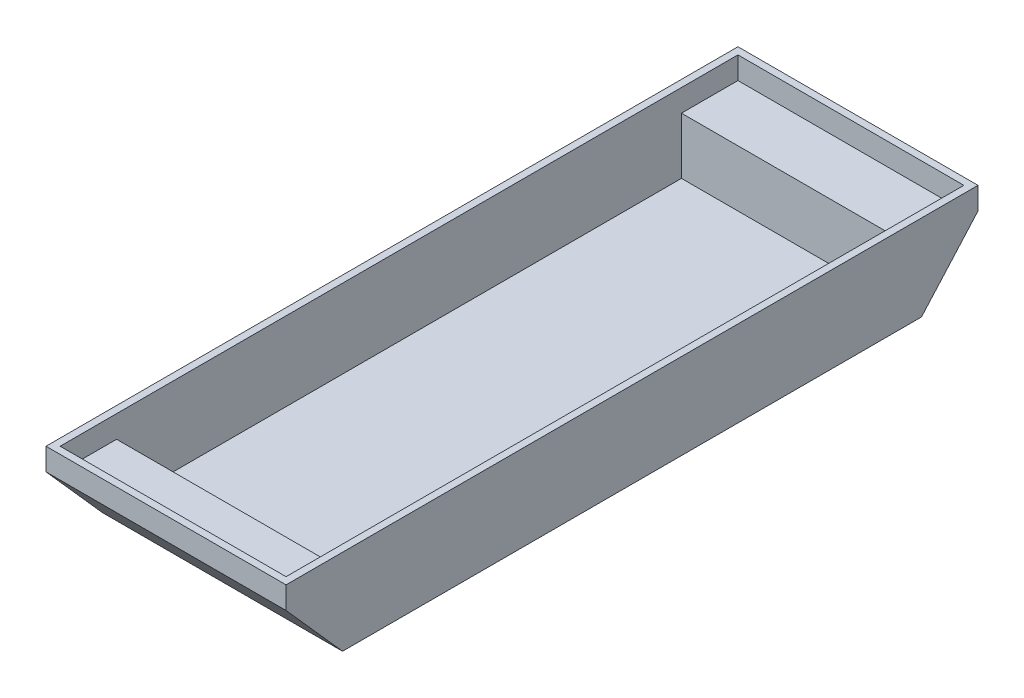
ISO-10303-21;
HEADER;
FILE_DESCRIPTION(('STEP AP214'),'2;1');
FILE_NAME('part.step','',(''),(''),'','','');
FILE_SCHEMA(('AUTOMOTIVE_DESIGN { 1 0 10303 214 1 1 1 1 }'));
ENDSEC;
DATA;
#1=APPLICATION_CONTEXT('core data for automotive mechanical design processes');
#2=APPLICATION_PROTOCOL_DEFINITION('international standard','automotive_design',2000,#1);
#3=PRODUCT_CONTEXT('',#1,'mechanical');
#4=PRODUCT('Part','Part','',(#3));
#5=PRODUCT_RELATED_PRODUCT_CATEGORY('part','',(#4));
#6=PRODUCT_DEFINITION_FORMATION('','',#4);
#7=PRODUCT_DEFINITION_CONTEXT('part definition',#1,'design');
#8=PRODUCT_DEFINITION('design','',#6,#7);
#9=PRODUCT_DEFINITION_SHAPE('','',#8);
#10=(LENGTH_UNIT() NAMED_UNIT(*) SI_UNIT(.MILLI.,.METRE.));
#11=(NAMED_UNIT(*) PLANE_ANGLE_UNIT() SI_UNIT($,.RADIAN.));
#12=(NAMED_UNIT(*) SI_UNIT($,.STERADIAN.) SOLID_ANGLE_UNIT());
#13=UNCERTAINTY_MEASURE_WITH_UNIT(LENGTH_MEASURE(1.E-05),#10,'distance_accuracy_value','');
#14=(GEOMETRIC_REPRESENTATION_CONTEXT(3) GLOBAL_UNCERTAINTY_ASSIGNED_CONTEXT((#13)) GLOBAL_UNIT_ASSIGNED_CONTEXT((#10,
#11,#12)) REPRESENTATION_CONTEXT('',''));
#15=CARTESIAN_POINT('',(0.,0.,0.));
#16=DIRECTION('',(0.,0.,1.));
#17=DIRECTION('',(1.,0.,0.));
#18=AXIS2_PLACEMENT_3D('',#15,#16,#17);
#19=CARTESIAN_POINT('',(26.9875,0.,-106.686950400119));
#20=DIRECTION('',(0.,0.,-1.));
#21=DIRECTION('',(-1.,0.,0.));
#22=AXIS2_PLACEMENT_3D('',#19,#20,#21);
#23=PLANE('',#22);
#24=DIRECTION('',(0.,1.,0.));
#25=VECTOR('',#24,1.);
#26=CARTESIAN_POINT('',(-25.4,0.,-106.686950400119));
#27=LINE('',#26,#25);
#28=CARTESIAN_POINT('',(-25.4,46.8041255840611,-106.686950400119));
#29=VERTEX_POINT('',#28);
#30=CARTESIAN_POINT('',(-25.4,51.804125584061,-106.686950400119));
#31=VERTEX_POINT('',#30);
#32=EDGE_CURVE('E547',#29,#31,#27,.T.);
#33=ORIENTED_EDGE('',*,*,#32,.F.);
#34=DIRECTION('',(-1.,0.,0.));
#35=VECTOR('',#34,1.);
#36=CARTESIAN_POINT('',(26.9875,46.8041255840611,-106.686950400119));
#37=LINE('',#36,#35);
#38=CARTESIAN_POINT('',(25.4,46.8041255840611,-106.686950400119));
#39=VERTEX_POINT('',#38);
#40=EDGE_CURVE('E158',#39,#29,#37,.T.);
#41=ORIENTED_EDGE('',*,*,#40,.F.);
#42=DIRECTION('',(0.,-1.,0.));
#43=VECTOR('',#42,1.);
#44=CARTESIAN_POINT('',(25.4,0.,-106.686950400119));
#45=LINE('',#44,#43);
#46=CARTESIAN_POINT('',(25.4,51.8041255840611,-106.686950400119));
#47=VERTEX_POINT('',#46);
#48=EDGE_CURVE('E55',#47,#39,#45,.T.);
#49=ORIENTED_EDGE('',*,*,#48,.F.);
#50=DIRECTION('',(-1.,0.,0.));
#51=VECTOR('',#50,1.);
#52=CARTESIAN_POINT('',(26.9875,51.8041255840611,-106.686950400119));
#53=LINE('',#52,#51);
#54=EDGE_CURVE('E171',#47,#31,#53,.T.);
#55=ORIENTED_EDGE('',*,*,#54,.T.);
#56=EDGE_LOOP('',(#33,#41,#49,#55));
#57=FACE_BOUND('',#56,.T.);
#58=ADVANCED_FACE('F39',(#57),#23,.F.);
#59=CARTESIAN_POINT('',(26.9875,46.8041255840611,0.));
#60=DIRECTION('',(0.,1.,0.));
#61=DIRECTION('',(0.,0.,1.));
#62=AXIS2_PLACEMENT_3D('',#59,#60,#61);
#63=PLANE('',#62);
#64=ORIENTED_EDGE('',*,*,#40,.T.);
#65=DIRECTION('',(0.,0.,-1.));
#66=VECTOR('',#65,1.);
#67=CARTESIAN_POINT('',(-25.4,46.8041255840611,-93.9869504001185));
#68=LINE('',#67,#66);
#69=CARTESIAN_POINT('',(-25.4,46.8041255840611,-93.9869504001185));
#70=VERTEX_POINT('',#69);
#71=EDGE_CURVE('E146',#70,#29,#68,.T.);
#72=ORIENTED_EDGE('',*,*,#71,.F.);
#73=DIRECTION('',(-1.,0.,0.));
#74=VECTOR('',#73,1.);
#75=CARTESIAN_POINT('',(26.9875,46.8041255840611,-93.9869504001185));
#76=LINE('',#75,#74);
#77=CARTESIAN_POINT('',(25.4,46.8041255840611,-93.9869504001185));
#78=VERTEX_POINT('',#77);
#79=EDGE_CURVE('E157',#78,#70,#76,.T.);
#80=ORIENTED_EDGE('',*,*,#79,.F.);
#81=DIRECTION('',(0.,0.,-1.));
#82=VECTOR('',#81,1.);
#83=CARTESIAN_POINT('',(25.4,46.8041255840611,-93.9869504001185));
#84=LINE('',#83,#82);
#85=EDGE_CURVE('E63',#78,#39,#84,.T.);
#86=ORIENTED_EDGE('',*,*,#85,.T.);
#87=EDGE_LOOP('',(#64,#72,#80,#86));
#88=FACE_BOUND('',#87,.T.);
#89=ADVANCED_FACE('F156',(#88),#63,.T.);
#90=CARTESIAN_POINT('',(26.9875,0.,-93.9869504001185));
#91=DIRECTION('',(0.,0.,1.));
#92=DIRECTION('',(1.,0.,0.));
#93=AXIS2_PLACEMENT_3D('',#90,#91,#92);
#94=PLANE('',#93);
#95=ORIENTED_EDGE('',*,*,#79,.T.);
#96=DIRECTION('',(0.,1.,0.));
#97=VECTOR('',#96,1.);
#98=CARTESIAN_POINT('',(-25.4,34.1041255840611,-93.9869504001185));
#99=LINE('',#98,#97);
#100=CARTESIAN_POINT('',(-25.4,34.1041255840611,-93.9869504001185));
#101=VERTEX_POINT('',#100);
#102=EDGE_CURVE('E143',#101,#70,#99,.T.);
#103=ORIENTED_EDGE('',*,*,#102,.F.);
#104=DIRECTION('',(-1.,0.,0.));
#105=VECTOR('',#104,1.);
#106=CARTESIAN_POINT('',(26.9875,34.1041255840611,-93.9869504001185));
#107=LINE('',#106,#105);
#108=CARTESIAN_POINT('',(25.4,34.1041255840611,-93.9869504001185));
#109=VERTEX_POINT('',#108);
#110=EDGE_CURVE('E166',#109,#101,#107,.T.);
#111=ORIENTED_EDGE('',*,*,#110,.F.);
#112=DIRECTION('',(0.,1.,0.));
#113=VECTOR('',#112,1.);
#114=CARTESIAN_POINT('',(25.4,34.1041255840611,-93.9869504001185));
#115=LINE('',#114,#113);
#116=EDGE_CURVE('E164',#109,#78,#115,.T.);
#117=ORIENTED_EDGE('',*,*,#116,.T.);
#118=EDGE_LOOP('',(#95,#103,#111,#117));
#119=FACE_BOUND('',#118,.T.);
#120=ADVANCED_FACE('F162',(#119),#94,.T.);
#121=CARTESIAN_POINT('',(26.9875,34.1041255840611,0.));
#122=DIRECTION('',(0.,1.,0.));
#123=DIRECTION('',(0.,0.,1.));
#124=AXIS2_PLACEMENT_3D('',#121,#122,#123);
#125=PLANE('',#124);
#126=ORIENTED_EDGE('',*,*,#110,.T.);
#127=DIRECTION('',(0.,0.,-1.));
#128=VECTOR('',#127,1.);
#129=CARTESIAN_POINT('',(-25.4,34.1041255840611,33.0130495998815));
#130=LINE('',#129,#128);
#131=CARTESIAN_POINT('',(-25.4,34.1041255840611,33.0130495998815));
#132=VERTEX_POINT('',#131);
#133=EDGE_CURVE('E149',#132,#101,#130,.T.);
#134=ORIENTED_EDGE('',*,*,#133,.F.);
#135=DIRECTION('',(-1.,0.,0.));
#136=VECTOR('',#135,1.);
#137=CARTESIAN_POINT('',(26.9875,34.1041255840611,33.0130495998815));
#138=LINE('',#137,#136);
#139=CARTESIAN_POINT('',(25.4,34.1041255840611,33.0130495998815));
#140=VERTEX_POINT('',#139);
#141=EDGE_CURVE('E174',#140,#132,#138,.T.);
#142=ORIENTED_EDGE('',*,*,#141,.F.);
#143=DIRECTION('',(0.,0.,-1.));
#144=VECTOR('',#143,1.);
#145=CARTESIAN_POINT('',(25.4,34.1041255840611,33.0130495998815));
#146=LINE('',#145,#144);
#147=EDGE_CURVE('E259',#140,#109,#146,.T.);
#148=ORIENTED_EDGE('',*,*,#147,.T.);
#149=EDGE_LOOP('',(#126,#134,#142,#148));
#150=FACE_BOUND('',#149,.T.);
#151=ADVANCED_FACE('F258',(#150),#125,.T.);
#152=CARTESIAN_POINT('',(26.9875,0.,33.0130495998815));
#153=DIRECTION('',(0.,0.,-1.));
#154=DIRECTION('',(-1.,0.,0.));
#155=AXIS2_PLACEMENT_3D('',#152,#153,#154);
#156=PLANE('',#155);
#157=ORIENTED_EDGE('',*,*,#141,.T.);
#158=DIRECTION('',(0.,-1.,0.));
#159=VECTOR('',#158,1.);
#160=CARTESIAN_POINT('',(-25.4,46.8041255840611,33.0130495998815));
#161=LINE('',#160,#159);
#162=CARTESIAN_POINT('',(-25.4,46.8041255840611,33.0130495998815));
#163=VERTEX_POINT('',#162);
#164=EDGE_CURVE('E253',#163,#132,#161,.T.);
#165=ORIENTED_EDGE('',*,*,#164,.F.);
#166=DIRECTION('',(-1.,0.,0.));
#167=VECTOR('',#166,1.);
#168=CARTESIAN_POINT('',(26.9875,46.8041255840611,33.0130495998815));
#169=LINE('',#168,#167);
#170=CARTESIAN_POINT('',(25.4,46.8041255840611,33.0130495998815));
#171=VERTEX_POINT('',#170);
#172=EDGE_CURVE('E242',#171,#163,#169,.T.);
#173=ORIENTED_EDGE('',*,*,#172,.F.);
#174=DIRECTION('',(0.,-1.,0.));
#175=VECTOR('',#174,1.);
#176=CARTESIAN_POINT('',(25.4,46.8041255840611,33.0130495998815));
#177=LINE('',#176,#175);
#178=EDGE_CURVE('E255',#171,#140,#177,.T.);
#179=ORIENTED_EDGE('',*,*,#178,.T.);
#180=EDGE_LOOP('',(#157,#165,#173,#179));
#181=FACE_BOUND('',#180,.T.);
#182=ADVANCED_FACE('F251',(#181),#156,.T.);
#183=CARTESIAN_POINT('',(26.9875,46.8041255840611,0.));
#184=DIRECTION('',(0.,1.,0.));
#185=DIRECTION('',(0.,0.,1.));
#186=AXIS2_PLACEMENT_3D('',#183,#184,#185);
#187=PLANE('',#186);
#188=ORIENTED_EDGE('',*,*,#172,.T.);
#189=DIRECTION('',(0.,0.,-1.));
#190=VECTOR('',#189,1.);
#191=CARTESIAN_POINT('',(-25.4,46.804125584061,47.3005495998815));
#192=LINE('',#191,#190);
#193=CARTESIAN_POINT('',(-25.4,46.804125584061,45.7130495998815));
#194=VERTEX_POINT('',#193);
#195=EDGE_CURVE('E545',#194,#163,#192,.T.);
#196=ORIENTED_EDGE('',*,*,#195,.F.);
#197=DIRECTION('',(-1.,0.,0.));
#198=VECTOR('',#197,1.);
#199=CARTESIAN_POINT('',(26.9875,46.804125584061,45.7130495998815));
#200=LINE('',#199,#198);
#201=CARTESIAN_POINT('',(25.4,46.804125584061,45.7130495998815));
#202=VERTEX_POINT('',#201);
#203=EDGE_CURVE('E238',#202,#194,#200,.T.);
#204=ORIENTED_EDGE('',*,*,#203,.F.);
#205=DIRECTION('',(0.,0.,-1.));
#206=VECTOR('',#205,1.);
#207=CARTESIAN_POINT('',(25.4,46.804125584061,47.3005495998815));
#208=LINE('',#207,#206);
#209=EDGE_CURVE('E269',#202,#171,#208,.T.);
#210=ORIENTED_EDGE('',*,*,#209,.T.);
#211=EDGE_LOOP('',(#188,#196,#204,#210));
#212=FACE_BOUND('',#211,.T.);
#213=ADVANCED_FACE('F344',(#212),#187,.T.);
#214=CARTESIAN_POINT('',(26.9875,0.,45.7130495998815));
#215=DIRECTION('',(0.,0.,-1.));
#216=DIRECTION('',(-1.,0.,0.));
#217=AXIS2_PLACEMENT_3D('',#214,#215,#216);
#218=PLANE('',#217);
#219=ORIENTED_EDGE('',*,*,#203,.T.);
#220=DIRECTION('',(0.,1.,0.));
#221=VECTOR('',#220,1.);
#222=CARTESIAN_POINT('',(-25.4,0.,45.7130495998815));
#223=LINE('',#222,#221);
#224=CARTESIAN_POINT('',(-25.4,51.804125584061,45.7130495998815));
#225=VERTEX_POINT('',#224);
#226=EDGE_CURVE('E542',#194,#225,#223,.T.);
#227=ORIENTED_EDGE('',*,*,#226,.T.);
#228=DIRECTION('',(-1.,0.,0.));
#229=VECTOR('',#228,1.);
#230=CARTESIAN_POINT('',(26.9875,51.8041255840611,45.7130495998815));
#231=LINE('',#230,#229);
#232=CARTESIAN_POINT('',(25.4,51.8041255840611,45.7130495998815));
#233=VERTEX_POINT('',#232);
#234=EDGE_CURVE('E234',#233,#225,#231,.T.);
#235=ORIENTED_EDGE('',*,*,#234,.F.);
#236=DIRECTION('',(0.,-1.,0.));
#237=VECTOR('',#236,1.);
#238=CARTESIAN_POINT('',(25.4,0.,45.7130495998815));
#239=LINE('',#238,#237);
#240=EDGE_CURVE('E279',#233,#202,#239,.T.);
#241=ORIENTED_EDGE('',*,*,#240,.T.);
#242=EDGE_LOOP('',(#219,#227,#235,#241));
#243=FACE_BOUND('',#242,.T.);
#244=ADVANCED_FACE('F340',(#243),#218,.T.);
#245=CARTESIAN_POINT('',(26.9875,-2.82879678490727,3.18239638302067));
#246=DIRECTION('',(0.,0.66436383882992,-0.747409318683659));
#247=DIRECTION('',(0.,0.747409318683659,0.66436383882992));
#248=AXIS2_PLACEMENT_3D('',#245,#246,#247);
#249=PLANE('',#248);
#250=DIRECTION('',(0.,-0.747409318683659,-0.66436383882992));
#251=VECTOR('',#250,1.);
#252=CARTESIAN_POINT('',(-26.9875,-2.82879678490727,3.18239638302067));
#253=LINE('',#252,#251);
#254=CARTESIAN_POINT('',(-26.9875,46.804125584061,47.3005495998815));
#255=VERTEX_POINT('',#254);
#256=CARTESIAN_POINT('',(-26.9875,32.5166255840611,34.6005495998815));
#257=VERTEX_POINT('',#256);
#258=EDGE_CURVE('E205',#255,#257,#253,.T.);
#259=ORIENTED_EDGE('',*,*,#258,.T.);
#260=DIRECTION('',(-1.,0.,0.));
#261=VECTOR('',#260,1.);
#262=CARTESIAN_POINT('',(26.9875,32.5166255840611,34.6005495998815));
#263=LINE('',#262,#261);
#264=CARTESIAN_POINT('',(26.9875,32.5166255840611,34.6005495998815));
#265=VERTEX_POINT('',#264);
#266=EDGE_CURVE('E11',#265,#257,#263,.T.);
#267=ORIENTED_EDGE('',*,*,#266,.F.);
#268=DIRECTION('',(0.,-0.747409318683659,-0.66436383882992));
#269=VECTOR('',#268,1.);
#270=CARTESIAN_POINT('',(26.9875,-2.82879678490727,3.18239638302067));
#271=LINE('',#270,#269);
#272=CARTESIAN_POINT('',(26.9875,46.804125584061,47.3005495998815));
#273=VERTEX_POINT('',#272);
#274=EDGE_CURVE('E226',#273,#265,#271,.T.);
#275=ORIENTED_EDGE('',*,*,#274,.F.);
#276=DIRECTION('',(-1.,0.,0.));
#277=VECTOR('',#276,1.);
#278=CARTESIAN_POINT('',(26.9875,46.804125584061,47.3005495998815));
#279=LINE('',#278,#277);
#280=EDGE_CURVE('E227',#273,#255,#279,.T.);
#281=ORIENTED_EDGE('',*,*,#280,.T.);
#282=EDGE_LOOP('',(#259,#267,#275,#281));
#283=FACE_BOUND('',#282,.T.);
#284=ADVANCED_FACE('F41',(#283),#249,.F.);
#285=CARTESIAN_POINT('',(26.9875,32.5166255840611,0.));
#286=DIRECTION('',(0.,1.,0.));
#287=DIRECTION('',(0.,0.,1.));
#288=AXIS2_PLACEMENT_3D('',#285,#286,#287);
#289=PLANE('',#288);
#290=DIRECTION('',(0.,0.,-1.));
#291=VECTOR('',#290,1.);
#292=CARTESIAN_POINT('',(-26.9875,32.5166255840611,0.));
#293=LINE('',#292,#291);
#294=CARTESIAN_POINT('',(-26.9875,32.5166255840611,-95.5744504001185));
#295=VERTEX_POINT('',#294);
#296=EDGE_CURVE('E198',#257,#295,#293,.T.);
#297=ORIENTED_EDGE('',*,*,#296,.T.);
#298=DIRECTION('',(-1.,0.,0.));
#299=VECTOR('',#298,1.);
#300=CARTESIAN_POINT('',(26.9875,32.5166255840611,-95.5744504001185));
#301=LINE('',#300,#299);
#302=CARTESIAN_POINT('',(26.9875,32.5166255840611,-95.5744504001185));
#303=VERTEX_POINT('',#302);
#304=EDGE_CURVE('E48',#303,#295,#301,.T.);
#305=ORIENTED_EDGE('',*,*,#304,.F.);
#306=DIRECTION('',(0.,0.,-1.));
#307=VECTOR('',#306,1.);
#308=CARTESIAN_POINT('',(26.9875,32.5166255840611,0.));
#309=LINE('',#308,#307);
#310=EDGE_CURVE('E286',#265,#303,#309,.T.);
#311=ORIENTED_EDGE('',*,*,#310,.F.);
#312=ORIENTED_EDGE('',*,*,#266,.T.);
#313=EDGE_LOOP('',(#297,#305,#311,#312));
#314=FACE_BOUND('',#313,.T.);
#315=ADVANCED_FACE('F199',(#314),#289,.F.);
#316=CARTESIAN_POINT('',(26.9875,-33.1054923546802,-37.2436788990152));
#317=DIRECTION('',(0.,-0.66436383882992,-0.747409318683659));
#318=DIRECTION('',(0.,0.747409318683659,-0.66436383882992));
#319=AXIS2_PLACEMENT_3D('',#316,#317,#318);
#320=PLANE('',#319);
#321=DIRECTION('',(0.,-0.747409318683659,0.66436383882992));
#322=VECTOR('',#321,1.);
#323=CARTESIAN_POINT('',(-26.9875,-33.1054923546802,-37.2436788990152));
#324=LINE('',#323,#322);
#325=CARTESIAN_POINT('',(-26.9875,46.8041255840611,-108.274450400119));
#326=VERTEX_POINT('',#325);
#327=EDGE_CURVE('E194',#326,#295,#324,.T.);
#328=ORIENTED_EDGE('',*,*,#327,.F.);
#329=DIRECTION('',(-1.,0.,0.));
#330=VECTOR('',#329,1.);
#331=CARTESIAN_POINT('',(26.9875,46.8041255840611,-108.274450400119));
#332=LINE('',#331,#330);
#333=CARTESIAN_POINT('',(26.9875,46.8041255840611,-108.274450400119));
#334=VERTEX_POINT('',#333);
#335=EDGE_CURVE('E183',#334,#326,#332,.T.);
#336=ORIENTED_EDGE('',*,*,#335,.F.);
#337=DIRECTION('',(0.,-0.747409318683659,0.66436383882992));
#338=VECTOR('',#337,1.);
#339=CARTESIAN_POINT('',(26.9875,-33.1054923546802,-37.2436788990152));
#340=LINE('',#339,#338);
#341=EDGE_CURVE('E196',#334,#303,#340,.T.);
#342=ORIENTED_EDGE('',*,*,#341,.T.);
#343=ORIENTED_EDGE('',*,*,#304,.T.);
#344=EDGE_LOOP('',(#328,#336,#342,#343));
#345=FACE_BOUND('',#344,.T.);
#346=ADVANCED_FACE('F192',(#345),#320,.T.);
#347=CARTESIAN_POINT('',(26.9875,0.,-108.274450400119));
#348=DIRECTION('',(0.,0.,1.));
#349=DIRECTION('',(1.,0.,0.));
#350=AXIS2_PLACEMENT_3D('',#347,#348,#349);
#351=PLANE('',#350);
#352=DIRECTION('',(0.,1.,0.));
#353=VECTOR('',#352,1.);
#354=CARTESIAN_POINT('',(-26.9875,0.,-108.274450400119));
#355=LINE('',#354,#353);
#356=CARTESIAN_POINT('',(-26.9875,51.8041255840611,-108.274450400119));
#357=VERTEX_POINT('',#356);
#358=EDGE_CURVE('E211',#326,#357,#355,.T.);
#359=ORIENTED_EDGE('',*,*,#358,.T.);
#360=DIRECTION('',(-1.,0.,0.));
#361=VECTOR('',#360,1.);
#362=CARTESIAN_POINT('',(26.9875,51.8041255840611,-108.274450400119));
#363=LINE('',#362,#361);
#364=CARTESIAN_POINT('',(26.9875,51.8041255840611,-108.274450400119));
#365=VERTEX_POINT('',#364);
#366=EDGE_CURVE('E180',#365,#357,#363,.T.);
#367=ORIENTED_EDGE('',*,*,#366,.F.);
#368=DIRECTION('',(0.,1.,0.));
#369=VECTOR('',#368,1.);
#370=CARTESIAN_POINT('',(26.9875,0.,-108.274450400119));
#371=LINE('',#370,#369);
#372=EDGE_CURVE('E290',#334,#365,#371,.T.);
#373=ORIENTED_EDGE('',*,*,#372,.F.);
#374=ORIENTED_EDGE('',*,*,#335,.T.);
#375=EDGE_LOOP('',(#359,#367,#373,#374));
#376=FACE_BOUND('',#375,.T.);
#377=ADVANCED_FACE('F312',(#376),#351,.F.);
#378=CARTESIAN_POINT('',(26.9875,51.8041255840611,0.));
#379=DIRECTION('',(0.,1.,0.));
#380=DIRECTION('',(0.,0.,1.));
#381=AXIS2_PLACEMENT_3D('',#378,#379,#380);
#382=PLANE('',#381);
#383=ORIENTED_EDGE('',*,*,#366,.T.);
#384=DIRECTION('',(0.,0.,-1.));
#385=VECTOR('',#384,1.);
#386=CARTESIAN_POINT('',(-26.9875,51.8041255840611,0.));
#387=LINE('',#386,#385);
#388=CARTESIAN_POINT('',(-26.9875,51.8041255840611,47.3005495998815));
#389=VERTEX_POINT('',#388);
#390=EDGE_CURVE('E217',#389,#357,#387,.T.);
#391=ORIENTED_EDGE('',*,*,#390,.F.);
#392=DIRECTION('',(-1.,0.,0.));
#393=VECTOR('',#392,1.);
#394=CARTESIAN_POINT('',(26.9875,51.8041255840611,47.3005495998815));
#395=LINE('',#394,#393);
#396=CARTESIAN_POINT('',(26.9875,51.8041255840611,47.3005495998815));
#397=VERTEX_POINT('',#396);
#398=EDGE_CURVE('E230',#397,#389,#395,.T.);
#399=ORIENTED_EDGE('',*,*,#398,.F.);
#400=DIRECTION('',(0.,0.,1.));
#401=VECTOR('',#400,1.);
#402=CARTESIAN_POINT('',(26.9875,51.8041255840611,0.));
#403=LINE('',#402,#401);
#404=EDGE_CURVE('E292',#365,#397,#403,.T.);
#405=ORIENTED_EDGE('',*,*,#404,.F.);
#406=EDGE_LOOP('',(#383,#391,#399,#405));
#407=FACE_BOUND('',#406,.T.);
#408=DIRECTION('',(0.,0.,1.));
#409=VECTOR('',#408,1.);
#410=CARTESIAN_POINT('',(-25.4,51.804125584061,-108.274450400119));
#411=LINE('',#410,#409);
#412=EDGE_CURVE('E160',#31,#225,#411,.T.);
#413=ORIENTED_EDGE('',*,*,#412,.F.);
#414=ORIENTED_EDGE('',*,*,#54,.F.);
#415=DIRECTION('',(0.,0.,1.));
#416=VECTOR('',#415,1.);
#417=CARTESIAN_POINT('',(25.4,51.804125584061,-108.274450400119));
#418=LINE('',#417,#416);
#419=EDGE_CURVE('E275',#47,#233,#418,.T.);
#420=ORIENTED_EDGE('',*,*,#419,.T.);
#421=ORIENTED_EDGE('',*,*,#234,.T.);
#422=EDGE_LOOP('',(#413,#414,#420,#421));
#423=FACE_BOUND('',#422,.T.);
#424=ADVANCED_FACE('F308',(#407,#423),#382,.T.);
#425=CARTESIAN_POINT('',(26.9875,0.,47.3005495998815));
#426=DIRECTION('',(0.,0.,1.));
#427=DIRECTION('',(1.,0.,0.));
#428=AXIS2_PLACEMENT_3D('',#425,#426,#427);
#429=PLANE('',#428);
#430=DIRECTION('',(0.,1.,0.));
#431=VECTOR('',#430,1.);
#432=CARTESIAN_POINT('',(-26.9875,0.,47.3005495998815));
#433=LINE('',#432,#431);
#434=EDGE_CURVE('E222',#255,#389,#433,.T.);
#435=ORIENTED_EDGE('',*,*,#434,.F.);
#436=ORIENTED_EDGE('',*,*,#280,.F.);
#437=DIRECTION('',(0.,1.,0.));
#438=VECTOR('',#437,1.);
#439=CARTESIAN_POINT('',(26.9875,0.,47.3005495998815));
#440=LINE('',#439,#438);
#441=EDGE_CURVE('E231',#273,#397,#440,.T.);
#442=ORIENTED_EDGE('',*,*,#441,.T.);
#443=ORIENTED_EDGE('',*,*,#398,.T.);
#444=EDGE_LOOP('',(#435,#436,#442,#443));
#445=FACE_BOUND('',#444,.T.);
#446=ADVANCED_FACE('F302',(#445),#429,.T.);
#447=CARTESIAN_POINT('',(26.9875,0.,0.));
#448=DIRECTION('',(1.,0.,0.));
#449=DIRECTION('',(0.,0.,-1.));
#450=AXIS2_PLACEMENT_3D('',#447,#448,#449);
#451=PLANE('',#450);
#452=ORIENTED_EDGE('',*,*,#404,.T.);
#453=ORIENTED_EDGE('',*,*,#441,.F.);
#454=ORIENTED_EDGE('',*,*,#274,.T.);
#455=ORIENTED_EDGE('',*,*,#310,.T.);
#456=ORIENTED_EDGE('',*,*,#341,.F.);
#457=ORIENTED_EDGE('',*,*,#372,.T.);
#458=EDGE_LOOP('',(#452,#453,#454,#455,#456,#457));
#459=FACE_BOUND('',#458,.T.);
#460=ADVANCED_FACE('F315',(#459),#451,.T.);
#461=CARTESIAN_POINT('',(-26.9875,0.,0.));
#462=DIRECTION('',(1.,0.,0.));
#463=DIRECTION('',(0.,0.,-1.));
#464=AXIS2_PLACEMENT_3D('',#461,#462,#463);
#465=PLANE('',#464);
#466=ORIENTED_EDGE('',*,*,#358,.F.);
#467=ORIENTED_EDGE('',*,*,#327,.T.);
#468=ORIENTED_EDGE('',*,*,#296,.F.);
#469=ORIENTED_EDGE('',*,*,#258,.F.);
#470=ORIENTED_EDGE('',*,*,#434,.T.);
#471=ORIENTED_EDGE('',*,*,#390,.T.);
#472=EDGE_LOOP('',(#466,#467,#468,#469,#470,#471));
#473=FACE_BOUND('',#472,.T.);
#474=ADVANCED_FACE('F208',(#473),#465,.F.);
#475=CARTESIAN_POINT('',(25.4,0.,0.));
#476=DIRECTION('',(1.,0.,0.));
#477=DIRECTION('',(0.,0.,-1.));
#478=AXIS2_PLACEMENT_3D('',#475,#476,#477);
#479=PLANE('',#478);
#480=ORIENTED_EDGE('',*,*,#419,.F.);
#481=ORIENTED_EDGE('',*,*,#48,.T.);
#482=ORIENTED_EDGE('',*,*,#85,.F.);
#483=ORIENTED_EDGE('',*,*,#116,.F.);
#484=ORIENTED_EDGE('',*,*,#147,.F.);
#485=ORIENTED_EDGE('',*,*,#178,.F.);
#486=ORIENTED_EDGE('',*,*,#209,.F.);
#487=ORIENTED_EDGE('',*,*,#240,.F.);
#488=EDGE_LOOP('',(#480,#481,#482,#483,#484,#485,#486,#487));
#489=FACE_BOUND('',#488,.T.);
#490=ADVANCED_FACE('F262',(#489),#479,.F.);
#491=CARTESIAN_POINT('',(-25.4,0.,0.));
#492=DIRECTION('',(-1.,0.,0.));
#493=DIRECTION('',(0.,0.,-1.));
#494=AXIS2_PLACEMENT_3D('',#491,#492,#493);
#495=PLANE('',#494);
#496=ORIENTED_EDGE('',*,*,#71,.T.);
#497=ORIENTED_EDGE('',*,*,#32,.T.);
#498=ORIENTED_EDGE('',*,*,#412,.T.);
#499=ORIENTED_EDGE('',*,*,#226,.F.);
#500=ORIENTED_EDGE('',*,*,#195,.T.);
#501=ORIENTED_EDGE('',*,*,#164,.T.);
#502=ORIENTED_EDGE('',*,*,#133,.T.);
#503=ORIENTED_EDGE('',*,*,#102,.T.);
#504=EDGE_LOOP('',(#496,#497,#498,#499,#500,#501,#502,#503));
#505=FACE_BOUND('',#504,.T.);
#506=ADVANCED_FACE('F145',(#505),#495,.F.);
#507=CLOSED_SHELL('',(#58,#89,#120,#151,#182,#213,#244,#284,#315,#346,#377,#424,#446,#460,#474,
#490,#506));
#508=MANIFOLD_SOLID_BREP('B2',#507);
#509=ADVANCED_BREP_SHAPE_REPRESENTATION('',(#18,#508),#14);
#510=SHAPE_DEFINITION_REPRESENTATION(#9,#509);
ENDSEC;
END-ISO-10303-21;
